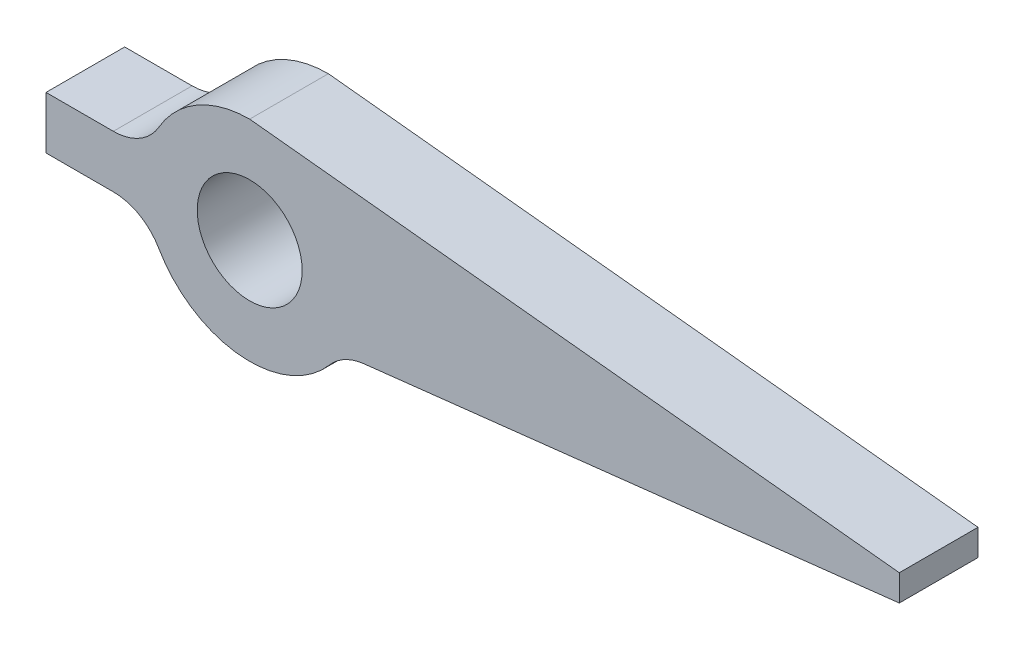
ISO-10303-21;
HEADER;
FILE_DESCRIPTION(('STEP AP214'),'2;1');
FILE_NAME('part.step','',(''),(''),'','','');
FILE_SCHEMA(('AUTOMOTIVE_DESIGN { 1 0 10303 214 1 1 1 1 }'));
ENDSEC;
DATA;
#1=APPLICATION_CONTEXT('core data for automotive mechanical design processes');
#2=APPLICATION_PROTOCOL_DEFINITION('international standard','automotive_design',2000,#1);
#3=PRODUCT_CONTEXT('',#1,'mechanical');
#4=PRODUCT('Part','Part','',(#3));
#5=PRODUCT_RELATED_PRODUCT_CATEGORY('part','',(#4));
#6=PRODUCT_DEFINITION_FORMATION('','',#4);
#7=PRODUCT_DEFINITION_CONTEXT('part definition',#1,'design');
#8=PRODUCT_DEFINITION('design','',#6,#7);
#9=PRODUCT_DEFINITION_SHAPE('','',#8);
#10=(LENGTH_UNIT() NAMED_UNIT(*) SI_UNIT(.MILLI.,.METRE.));
#11=(NAMED_UNIT(*) PLANE_ANGLE_UNIT() SI_UNIT($,.RADIAN.));
#12=(NAMED_UNIT(*) SI_UNIT($,.STERADIAN.) SOLID_ANGLE_UNIT());
#13=UNCERTAINTY_MEASURE_WITH_UNIT(LENGTH_MEASURE(1.E-05),#10,'distance_accuracy_value','');
#14=(GEOMETRIC_REPRESENTATION_CONTEXT(3) GLOBAL_UNCERTAINTY_ASSIGNED_CONTEXT((#13)) GLOBAL_UNIT_ASSIGNED_CONTEXT((#10,
#11,#12)) REPRESENTATION_CONTEXT('',''));
#15=CARTESIAN_POINT('',(0.,0.,0.));
#16=DIRECTION('',(0.,0.,1.));
#17=DIRECTION('',(1.,0.,0.));
#18=AXIS2_PLACEMENT_3D('',#15,#16,#17);
#19=CARTESIAN_POINT('',(1.80959474624118,17.2869736289204,1.5));
#20=DIRECTION('',(0.104110812603087,0.994565703560667,0.));
#21=DIRECTION('',(-0.994565703560667,0.104110812603087,0.));
#22=AXIS2_PLACEMENT_3D('',#19,#20,#21);
#23=PLANE('',#22);
#24=DIRECTION('',(0.994565703560667,-0.104110812603087,0.));
#25=VECTOR('',#24,1.);
#26=CARTESIAN_POINT('',(1.80959474624118,17.2869736289204,0.));
#27=LINE('',#26,#25);
#28=CARTESIAN_POINT('',(-11.2160550410776,18.6504943889727,0.));
#29=VERTEX_POINT('',#28);
#30=CARTESIAN_POINT('',(1.16628796825272,17.3543147720643,0.));
#31=VERTEX_POINT('',#30);
#32=EDGE_CURVE('E131',#29,#31,#27,.T.);
#33=ORIENTED_EDGE('',*,*,#32,.F.);
#34=DIRECTION('',(0.,0.,-1.));
#35=VECTOR('',#34,1.);
#36=CARTESIAN_POINT('',(-11.2160550410776,18.6504943889727,1.5));
#37=LINE('',#36,#35);
#38=CARTESIAN_POINT('',(-11.2160550410776,18.6504943889727,1.5));
#39=VERTEX_POINT('',#38);
#40=EDGE_CURVE('E125',#39,#29,#37,.T.);
#41=ORIENTED_EDGE('',*,*,#40,.F.);
#42=DIRECTION('',(0.994565703560667,-0.104110812603087,0.));
#43=VECTOR('',#42,1.);
#44=CARTESIAN_POINT('',(1.80959474624118,17.2869736289204,1.5));
#45=LINE('',#44,#43);
#46=CARTESIAN_POINT('',(1.16628796825272,17.3543147720643,1.5));
#47=VERTEX_POINT('',#46);
#48=EDGE_CURVE('E128',#39,#47,#45,.T.);
#49=ORIENTED_EDGE('',*,*,#48,.T.);
#50=DIRECTION('',(0.,0.,-1.));
#51=VECTOR('',#50,1.);
#52=CARTESIAN_POINT('',(1.16628796825272,17.3543147720643,1.5));
#53=LINE('',#52,#51);
#54=EDGE_CURVE('E182',#47,#31,#53,.T.);
#55=ORIENTED_EDGE('',*,*,#54,.T.);
#56=EDGE_LOOP('',(#33,#41,#49,#55));
#57=FACE_BOUND('',#56,.T.);
#58=ADVANCED_FACE('F41',(#57),#23,.T.);
#59=CARTESIAN_POINT('',(-11.2160550410776,16.6504943889727,1.5));
#60=DIRECTION('',(0.,0.,-1.));
#61=DIRECTION('',(-1.,0.,0.));
#62=AXIS2_PLACEMENT_3D('',#59,#60,#61);
#63=CYLINDRICAL_SURFACE('',#62,2.);
#64=CARTESIAN_POINT('',(-11.2160550410776,16.6504943889727,0.));
#65=DIRECTION('',(0.,0.,1.));
#66=DIRECTION('',(1.,0.,0.));
#67=AXIS2_PLACEMENT_3D('',#64,#65,#66);
#68=CIRCLE('',#67,2.);
#69=CARTESIAN_POINT('',(-12.9481058486464,17.6504943889727,0.));
#70=VERTEX_POINT('',#69);
#71=EDGE_CURVE('E185',#29,#70,#68,.T.);
#72=ORIENTED_EDGE('',*,*,#71,.T.);
#73=DIRECTION('',(0.,0.,-1.));
#74=VECTOR('',#73,1.);
#75=CARTESIAN_POINT('',(-12.9481058486464,17.6504943889727,1.5));
#76=LINE('',#75,#74);
#77=CARTESIAN_POINT('',(-12.9481058486464,17.6504943889727,1.5));
#78=VERTEX_POINT('',#77);
#79=EDGE_CURVE('E143',#70,#78,#76,.F.);
#80=ORIENTED_EDGE('',*,*,#79,.T.);
#81=CARTESIAN_POINT('',(-11.2160550410776,16.6504943889727,1.5));
#82=DIRECTION('',(0.,0.,1.));
#83=DIRECTION('',(1.,0.,0.));
#84=AXIS2_PLACEMENT_3D('',#81,#82,#83);
#85=CIRCLE('',#84,2.);
#86=EDGE_CURVE('E140',#39,#78,#85,.T.);
#87=ORIENTED_EDGE('',*,*,#86,.F.);
#88=ORIENTED_EDGE('',*,*,#40,.T.);
#89=EDGE_LOOP('',(#72,#80,#87,#88));
#90=FACE_BOUND('',#89,.T.);
#91=ADVANCED_FACE('F141',(#90),#63,.T.);
#92=CARTESIAN_POINT('',(0.,17.1504943889727,1.5));
#93=DIRECTION('',(0.,1.,0.));
#94=DIRECTION('',(0.,0.,1.));
#95=AXIS2_PLACEMENT_3D('',#92,#93,#94);
#96=PLANE('',#95);
#97=DIRECTION('',(1.,0.,0.));
#98=VECTOR('',#97,1.);
#99=CARTESIAN_POINT('',(0.,17.1504943889727,1.5));
#100=LINE('',#99,#98);
#101=CARTESIAN_POINT('',(-15.0981058486465,17.1504943889727,1.5));
#102=VERTEX_POINT('',#101);
#103=CARTESIAN_POINT('',(-13.8141312524309,17.1504943889727,1.5));
#104=VERTEX_POINT('',#103);
#105=EDGE_CURVE('E147',#102,#104,#100,.T.);
#106=ORIENTED_EDGE('',*,*,#105,.T.);
#107=DIRECTION('',(0.,0.,-1.));
#108=VECTOR('',#107,1.);
#109=CARTESIAN_POINT('',(-13.8141312524309,17.1504943889727,1.5));
#110=LINE('',#109,#108);
#111=CARTESIAN_POINT('',(-13.8141312524309,17.1504943889727,0.));
#112=VERTEX_POINT('',#111);
#113=EDGE_CURVE('E230',#104,#112,#110,.T.);
#114=ORIENTED_EDGE('',*,*,#113,.T.);
#115=DIRECTION('',(1.,0.,0.));
#116=VECTOR('',#115,1.);
#117=CARTESIAN_POINT('',(0.,17.1504943889727,0.));
#118=LINE('',#117,#116);
#119=CARTESIAN_POINT('',(-15.0981058486465,17.1504943889727,0.));
#120=VERTEX_POINT('',#119);
#121=EDGE_CURVE('E188',#120,#112,#118,.T.);
#122=ORIENTED_EDGE('',*,*,#121,.F.);
#123=DIRECTION('',(0.,0.,-1.));
#124=VECTOR('',#123,1.);
#125=CARTESIAN_POINT('',(-15.0981058486465,17.1504943889727,1.5));
#126=LINE('',#125,#124);
#127=EDGE_CURVE('E137',#102,#120,#126,.T.);
#128=ORIENTED_EDGE('',*,*,#127,.F.);
#129=EDGE_LOOP('',(#106,#114,#122,#128));
#130=FACE_BOUND('',#129,.T.);
#131=ADVANCED_FACE('F279',(#130),#96,.T.);
#132=CARTESIAN_POINT('',(-15.0981058486465,0.,1.5));
#133=DIRECTION('',(-1.,0.,0.));
#134=DIRECTION('',(0.,0.,1.));
#135=AXIS2_PLACEMENT_3D('',#132,#133,#134);
#136=PLANE('',#135);
#137=DIRECTION('',(0.,1.,0.));
#138=VECTOR('',#137,1.);
#139=CARTESIAN_POINT('',(-15.0981058486465,0.,0.));
#140=LINE('',#139,#138);
#141=CARTESIAN_POINT('',(-15.0981058486465,16.1504943889727,0.));
#142=VERTEX_POINT('',#141);
#143=EDGE_CURVE('E193',#142,#120,#140,.T.);
#144=ORIENTED_EDGE('',*,*,#143,.F.);
#145=DIRECTION('',(0.,0.,-1.));
#146=VECTOR('',#145,1.);
#147=CARTESIAN_POINT('',(-15.0981058486465,16.1504943889727,1.5));
#148=LINE('',#147,#146);
#149=CARTESIAN_POINT('',(-15.0981058486465,16.1504943889727,1.5));
#150=VERTEX_POINT('',#149);
#151=EDGE_CURVE('E213',#150,#142,#148,.T.);
#152=ORIENTED_EDGE('',*,*,#151,.F.);
#153=DIRECTION('',(0.,1.,0.));
#154=VECTOR('',#153,1.);
#155=CARTESIAN_POINT('',(-15.0981058486465,0.,1.5));
#156=LINE('',#155,#154);
#157=EDGE_CURVE('E165',#150,#102,#156,.T.);
#158=ORIENTED_EDGE('',*,*,#157,.T.);
#159=ORIENTED_EDGE('',*,*,#127,.T.);
#160=EDGE_LOOP('',(#144,#152,#158,#159));
#161=FACE_BOUND('',#160,.T.);
#162=ADVANCED_FACE('F300',(#161),#136,.T.);
#163=CARTESIAN_POINT('',(0.,16.1504943889727,1.5));
#164=DIRECTION('',(0.,1.,0.));
#165=DIRECTION('',(0.,0.,1.));
#166=AXIS2_PLACEMENT_3D('',#163,#164,#165);
#167=PLANE('',#166);
#168=DIRECTION('',(1.,0.,0.));
#169=VECTOR('',#168,1.);
#170=CARTESIAN_POINT('',(0.,16.1504943889727,0.));
#171=LINE('',#170,#169);
#172=CARTESIAN_POINT('',(-13.8141312524309,16.1504943889727,0.));
#173=VERTEX_POINT('',#172);
#174=EDGE_CURVE('E197',#142,#173,#171,.T.);
#175=ORIENTED_EDGE('',*,*,#174,.T.);
#176=DIRECTION('',(0.,0.,1.));
#177=VECTOR('',#176,1.);
#178=CARTESIAN_POINT('',(-13.8141312524309,16.1504943889727,1.5));
#179=LINE('',#178,#177);
#180=CARTESIAN_POINT('',(-13.8141312524309,16.1504943889727,1.5));
#181=VERTEX_POINT('',#180);
#182=EDGE_CURVE('E221',#173,#181,#179,.T.);
#183=ORIENTED_EDGE('',*,*,#182,.T.);
#184=DIRECTION('',(1.,0.,0.));
#185=VECTOR('',#184,1.);
#186=CARTESIAN_POINT('',(0.,16.1504943889727,1.5));
#187=LINE('',#186,#185);
#188=EDGE_CURVE('E169',#150,#181,#187,.T.);
#189=ORIENTED_EDGE('',*,*,#188,.F.);
#190=ORIENTED_EDGE('',*,*,#151,.T.);
#191=EDGE_LOOP('',(#175,#183,#189,#190));
#192=FACE_BOUND('',#191,.T.);
#193=ADVANCED_FACE('F306',(#192),#167,.F.);
#194=CARTESIAN_POINT('',(-12.9481058486465,15.6504943889727,0.));
#195=VERTEX_POINT('',#194);
#196=CARTESIAN_POINT('',(-9.69271228865769,15.3545673622271,0.));
#197=VERTEX_POINT('',#196);
#198=EDGE_CURVE('E189',#195,#197,#68,.T.);
#199=ORIENTED_EDGE('',*,*,#198,.T.);
#200=DIRECTION('',(0.,0.,-1.));
#201=VECTOR('',#200,1.);
#202=CARTESIAN_POINT('',(-9.69271228865769,15.3545673622271,1.5));
#203=LINE('',#202,#201);
#204=CARTESIAN_POINT('',(-9.69271228865769,15.3545673622271,1.5));
#205=VERTEX_POINT('',#204);
#206=EDGE_CURVE('E63',#197,#205,#203,.F.);
#207=ORIENTED_EDGE('',*,*,#206,.T.);
#208=CARTESIAN_POINT('',(-12.9481058486465,15.6504943889727,1.5));
#209=VERTEX_POINT('',#208);
#210=EDGE_CURVE('E149',#209,#205,#85,.T.);
#211=ORIENTED_EDGE('',*,*,#210,.F.);
#212=DIRECTION('',(0.,0.,-1.));
#213=VECTOR('',#212,1.);
#214=CARTESIAN_POINT('',(-12.9481058486465,15.6504943889727,1.5));
#215=LINE('',#214,#213);
#216=EDGE_CURVE('E136',#209,#195,#215,.T.);
#217=ORIENTED_EDGE('',*,*,#216,.T.);
#218=EDGE_LOOP('',(#199,#207,#211,#217));
#219=FACE_BOUND('',#218,.T.);
#220=ADVANCED_FACE('F272',(#219),#63,.T.);
#221=CARTESIAN_POINT('',(-1.86534904774036,16.5112097117122,1.5));
#222=DIRECTION('',(-0.112260569769554,0.993678803474752,0.));
#223=DIRECTION('',(-0.993678803474752,-0.112260569769554,0.));
#224=AXIS2_PLACEMENT_3D('',#221,#222,#223);
#225=PLANE('',#224);
#226=DIRECTION('',(0.993678803474752,0.112260569769554,0.));
#227=VECTOR('',#226,1.);
#228=CARTESIAN_POINT('',(-1.86534904774036,16.5112097117122,1.5));
#229=LINE('',#228,#227);
#230=CARTESIAN_POINT('',(-9.04330148221729,15.700282652329,1.5));
#231=VERTEX_POINT('',#230);
#232=CARTESIAN_POINT('',(1.16628796825272,16.853708009512,1.5));
#233=VERTEX_POINT('',#232);
#234=EDGE_CURVE('E173',#231,#233,#229,.T.);
#235=ORIENTED_EDGE('',*,*,#234,.F.);
#236=DIRECTION('',(0.,0.,1.));
#237=VECTOR('',#236,1.);
#238=CARTESIAN_POINT('',(-9.04330148221729,15.700282652329,0.));
#239=LINE('',#238,#237);
#240=CARTESIAN_POINT('',(-9.04330148221729,15.700282652329,0.));
#241=VERTEX_POINT('',#240);
#242=EDGE_CURVE('E242',#231,#241,#239,.F.);
#243=ORIENTED_EDGE('',*,*,#242,.T.);
#244=DIRECTION('',(0.993678803474752,0.112260569769554,0.));
#245=VECTOR('',#244,1.);
#246=CARTESIAN_POINT('',(-1.86534904774036,16.5112097117122,0.));
#247=LINE('',#246,#245);
#248=CARTESIAN_POINT('',(1.16628796825272,16.853708009512,0.));
#249=VERTEX_POINT('',#248);
#250=EDGE_CURVE('E201',#241,#249,#247,.T.);
#251=ORIENTED_EDGE('',*,*,#250,.T.);
#252=DIRECTION('',(0.,0.,-1.));
#253=VECTOR('',#252,1.);
#254=CARTESIAN_POINT('',(1.16628796825272,16.853708009512,1.5));
#255=LINE('',#254,#253);
#256=EDGE_CURVE('E209',#233,#249,#255,.T.);
#257=ORIENTED_EDGE('',*,*,#256,.F.);
#258=EDGE_LOOP('',(#235,#243,#251,#257));
#259=FACE_BOUND('',#258,.T.);
#260=ADVANCED_FACE('F256',(#259),#225,.F.);
#261=CARTESIAN_POINT('',(1.1662879682527,0.,1.5));
#262=DIRECTION('',(1.,0.,0.));
#263=DIRECTION('',(0.,1.,0.));
#264=AXIS2_PLACEMENT_3D('',#261,#262,#263);
#265=PLANE('',#264);
#266=DIRECTION('',(0.,-1.,0.));
#267=VECTOR('',#266,1.);
#268=CARTESIAN_POINT('',(1.1662879682527,0.,0.));
#269=LINE('',#268,#267);
#270=EDGE_CURVE('E159',#31,#249,#269,.T.);
#271=ORIENTED_EDGE('',*,*,#270,.F.);
#272=ORIENTED_EDGE('',*,*,#54,.F.);
#273=DIRECTION('',(0.,-1.,0.));
#274=VECTOR('',#273,1.);
#275=CARTESIAN_POINT('',(1.1662879682527,0.,1.5));
#276=LINE('',#275,#274);
#277=EDGE_CURVE('E153',#47,#233,#276,.T.);
#278=ORIENTED_EDGE('',*,*,#277,.T.);
#279=ORIENTED_EDGE('',*,*,#256,.T.);
#280=EDGE_LOOP('',(#271,#272,#278,#279));
#281=FACE_BOUND('',#280,.T.);
#282=ADVANCED_FACE('F262',(#281),#265,.T.);
#283=CARTESIAN_POINT('',(-11.2160550410776,16.6504943889727,1.5));
#284=DIRECTION('',(0.,0.,-1.));
#285=DIRECTION('',(-1.,0.,0.));
#286=AXIS2_PLACEMENT_3D('',#283,#284,#285);
#287=CYLINDRICAL_SURFACE('',#286,1.);
#288=CARTESIAN_POINT('',(-11.2160550410776,16.6504943889727,1.5));
#289=DIRECTION('',(0.,0.,1.));
#290=DIRECTION('',(1.,0.,0.));
#291=AXIS2_PLACEMENT_3D('',#288,#289,#290);
#292=CIRCLE('',#291,1.);
#293=CARTESIAN_POINT('',(-10.2160550410776,16.6504943889727,1.5));
#294=VERTEX_POINT('',#293);
#295=EDGE_CURVE('E178',#294,#294,#292,.T.);
#296=ORIENTED_EDGE('',*,*,#295,.T.);
#297=EDGE_LOOP('',(#296));
#298=FACE_BOUND('',#297,.T.);
#299=CARTESIAN_POINT('',(-11.2160550410776,16.6504943889727,0.));
#300=DIRECTION('',(0.,0.,1.));
#301=DIRECTION('',(1.,0.,0.));
#302=AXIS2_PLACEMENT_3D('',#299,#300,#301);
#303=CIRCLE('',#302,1.);
#304=CARTESIAN_POINT('',(-10.2160550410776,16.6504943889727,0.));
#305=VERTEX_POINT('',#304);
#306=EDGE_CURVE('E155',#305,#305,#303,.T.);
#307=ORIENTED_EDGE('',*,*,#306,.F.);
#308=EDGE_LOOP('',(#307));
#309=FACE_BOUND('',#308,.T.);
#310=ADVANCED_FACE('F264',(#298,#309),#287,.F.);
#311=CARTESIAN_POINT('',(0.,0.,1.5));
#312=DIRECTION('',(0.,0.,1.));
#313=DIRECTION('',(1.,0.,0.));
#314=AXIS2_PLACEMENT_3D('',#311,#312,#313);
#315=PLANE('',#314);
#316=ORIENTED_EDGE('',*,*,#48,.F.);
#317=ORIENTED_EDGE('',*,*,#86,.T.);
#318=CARTESIAN_POINT('',(-13.8141312524309,18.1504943889727,1.5));
#319=DIRECTION('',(0.,0.,1.));
#320=DIRECTION('',(1.,0.,0.));
#321=AXIS2_PLACEMENT_3D('',#318,#319,#320);
#322=CIRCLE('',#321,1.);
#323=EDGE_CURVE('E239',#78,#104,#322,.F.);
#324=ORIENTED_EDGE('',*,*,#323,.T.);
#325=ORIENTED_EDGE('',*,*,#105,.F.);
#326=ORIENTED_EDGE('',*,*,#157,.F.);
#327=ORIENTED_EDGE('',*,*,#188,.T.);
#328=CARTESIAN_POINT('',(-13.8141312524309,15.1504943889727,1.5));
#329=DIRECTION('',(0.,0.,1.));
#330=DIRECTION('',(1.,0.,0.));
#331=AXIS2_PLACEMENT_3D('',#328,#329,#330);
#332=CIRCLE('',#331,1.);
#333=EDGE_CURVE('E227',#181,#209,#332,.F.);
#334=ORIENTED_EDGE('',*,*,#333,.T.);
#335=ORIENTED_EDGE('',*,*,#210,.T.);
#336=CARTESIAN_POINT('',(-8.93104091244774,14.7066038488543,1.5));
#337=DIRECTION('',(0.,0.,1.));
#338=DIRECTION('',(1.,0.,0.));
#339=AXIS2_PLACEMENT_3D('',#336,#337,#338);
#340=CIRCLE('',#339,1.);
#341=EDGE_CURVE('E11',#205,#231,#340,.F.);
#342=ORIENTED_EDGE('',*,*,#341,.T.);
#343=ORIENTED_EDGE('',*,*,#234,.T.);
#344=ORIENTED_EDGE('',*,*,#277,.F.);
#345=EDGE_LOOP('',(#316,#317,#324,#325,#326,#327,#334,#335,#342,#343,#344));
#346=FACE_BOUND('',#345,.T.);
#347=ORIENTED_EDGE('',*,*,#295,.F.);
#348=EDGE_LOOP('',(#347));
#349=FACE_BOUND('',#348,.T.);
#350=ADVANCED_FACE('F150',(#346,#349),#315,.T.);
#351=CARTESIAN_POINT('',(0.,0.,0.));
#352=DIRECTION('',(0.,0.,1.));
#353=DIRECTION('',(1.,0.,0.));
#354=AXIS2_PLACEMENT_3D('',#351,#352,#353);
#355=PLANE('',#354);
#356=ORIENTED_EDGE('',*,*,#32,.T.);
#357=ORIENTED_EDGE('',*,*,#270,.T.);
#358=ORIENTED_EDGE('',*,*,#250,.F.);
#359=CARTESIAN_POINT('',(-8.93104091244774,14.7066038488543,0.));
#360=DIRECTION('',(0.,0.,1.));
#361=DIRECTION('',(1.,0.,0.));
#362=AXIS2_PLACEMENT_3D('',#359,#360,#361);
#363=CIRCLE('',#362,1.);
#364=EDGE_CURVE('E50',#241,#197,#363,.T.);
#365=ORIENTED_EDGE('',*,*,#364,.T.);
#366=ORIENTED_EDGE('',*,*,#198,.F.);
#367=CARTESIAN_POINT('',(-13.8141312524309,15.1504943889727,0.));
#368=DIRECTION('',(0.,0.,1.));
#369=DIRECTION('',(1.,0.,0.));
#370=AXIS2_PLACEMENT_3D('',#367,#368,#369);
#371=CIRCLE('',#370,1.);
#372=EDGE_CURVE('E224',#195,#173,#371,.T.);
#373=ORIENTED_EDGE('',*,*,#372,.T.);
#374=ORIENTED_EDGE('',*,*,#174,.F.);
#375=ORIENTED_EDGE('',*,*,#143,.T.);
#376=ORIENTED_EDGE('',*,*,#121,.T.);
#377=CARTESIAN_POINT('',(-13.8141312524309,18.1504943889727,0.));
#378=DIRECTION('',(0.,0.,1.));
#379=DIRECTION('',(1.,0.,0.));
#380=AXIS2_PLACEMENT_3D('',#377,#378,#379);
#381=CIRCLE('',#380,1.);
#382=EDGE_CURVE('E236',#112,#70,#381,.T.);
#383=ORIENTED_EDGE('',*,*,#382,.T.);
#384=ORIENTED_EDGE('',*,*,#71,.F.);
#385=EDGE_LOOP('',(#356,#357,#358,#365,#366,#373,#374,#375,#376,#383,#384));
#386=FACE_BOUND('',#385,.T.);
#387=ORIENTED_EDGE('',*,*,#306,.T.);
#388=EDGE_LOOP('',(#387));
#389=FACE_BOUND('',#388,.T.);
#390=ADVANCED_FACE('F258',(#386,#389),#355,.F.);
#391=CARTESIAN_POINT('',(-13.8141312524309,15.1504943889727,1.5));
#392=DIRECTION('',(0.,0.,-1.));
#393=DIRECTION('',(-1.,0.,0.));
#394=AXIS2_PLACEMENT_3D('',#391,#392,#393);
#395=CYLINDRICAL_SURFACE('',#394,1.);
#396=ORIENTED_EDGE('',*,*,#333,.F.);
#397=ORIENTED_EDGE('',*,*,#182,.F.);
#398=ORIENTED_EDGE('',*,*,#372,.F.);
#399=ORIENTED_EDGE('',*,*,#216,.F.);
#400=EDGE_LOOP('',(#396,#397,#398,#399));
#401=FACE_BOUND('',#400,.T.);
#402=ADVANCED_FACE('F284',(#401),#395,.F.);
#403=CARTESIAN_POINT('',(-13.8141312524309,18.1504943889727,1.5));
#404=DIRECTION('',(0.,0.,-1.));
#405=DIRECTION('',(-1.,0.,0.));
#406=AXIS2_PLACEMENT_3D('',#403,#404,#405);
#407=CYLINDRICAL_SURFACE('',#406,1.);
#408=ORIENTED_EDGE('',*,*,#323,.F.);
#409=ORIENTED_EDGE('',*,*,#79,.F.);
#410=ORIENTED_EDGE('',*,*,#382,.F.);
#411=ORIENTED_EDGE('',*,*,#113,.F.);
#412=EDGE_LOOP('',(#408,#409,#410,#411));
#413=FACE_BOUND('',#412,.T.);
#414=ADVANCED_FACE('F286',(#413),#407,.F.);
#415=CARTESIAN_POINT('',(-8.93104091244774,14.7066038488543,1.5));
#416=DIRECTION('',(0.,0.,-1.));
#417=DIRECTION('',(-1.,0.,0.));
#418=AXIS2_PLACEMENT_3D('',#415,#416,#417);
#419=CYLINDRICAL_SURFACE('',#418,1.);
#420=ORIENTED_EDGE('',*,*,#341,.F.);
#421=ORIENTED_EDGE('',*,*,#206,.F.);
#422=ORIENTED_EDGE('',*,*,#364,.F.);
#423=ORIENTED_EDGE('',*,*,#242,.F.);
#424=EDGE_LOOP('',(#420,#421,#422,#423));
#425=FACE_BOUND('',#424,.T.);
#426=ADVANCED_FACE('F43',(#425),#419,.F.);
#427=CLOSED_SHELL('',(#58,#91,#131,#162,#193,#220,#260,#282,#310,#350,#390,#402,#414,#426));
#428=MANIFOLD_SOLID_BREP('B2',#427);
#429=ADVANCED_BREP_SHAPE_REPRESENTATION('',(#18,#428),#14);
#430=SHAPE_DEFINITION_REPRESENTATION(#9,#429);
ENDSEC;
END-ISO-10303-21;
